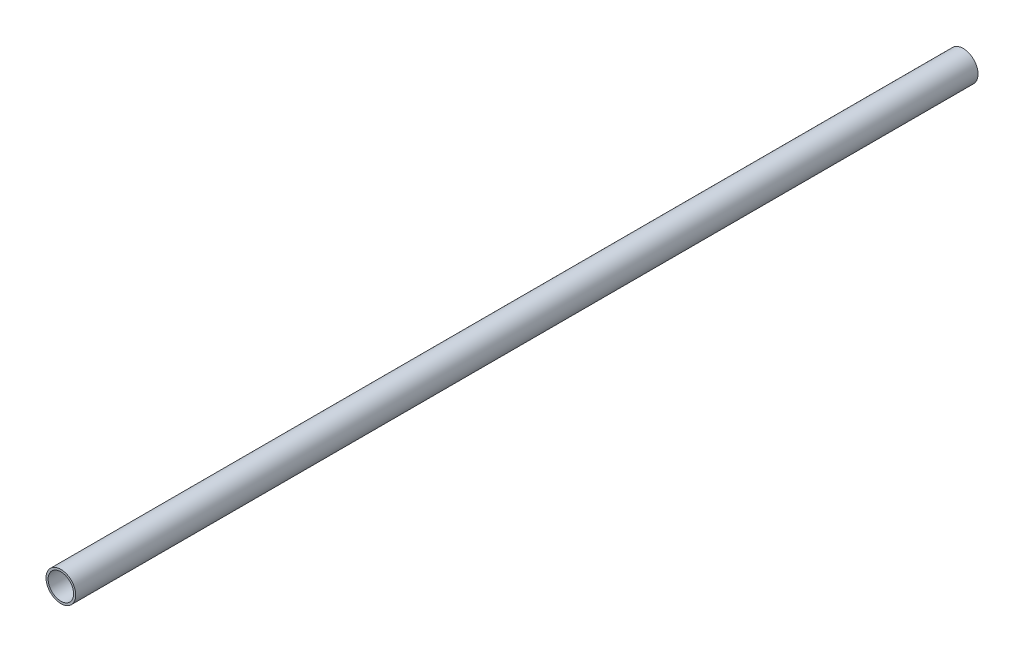
ISO-10303-21;
HEADER;
FILE_DESCRIPTION(('STEP AP214'),'2;1');
FILE_NAME('part.step','',(''),(''),'','','');
FILE_SCHEMA(('AUTOMOTIVE_DESIGN { 1 0 10303 214 1 1 1 1 }'));
ENDSEC;
DATA;
#1=APPLICATION_CONTEXT('core data for automotive mechanical design processes');
#2=APPLICATION_PROTOCOL_DEFINITION('international standard','automotive_design',2000,#1);
#3=PRODUCT_CONTEXT('',#1,'mechanical');
#4=PRODUCT('Part','Part','',(#3));
#5=PRODUCT_RELATED_PRODUCT_CATEGORY('part','',(#4));
#6=PRODUCT_DEFINITION_FORMATION('','',#4);
#7=PRODUCT_DEFINITION_CONTEXT('part definition',#1,'design');
#8=PRODUCT_DEFINITION('design','',#6,#7);
#9=PRODUCT_DEFINITION_SHAPE('','',#8);
#10=(LENGTH_UNIT() NAMED_UNIT(*) SI_UNIT(.MILLI.,.METRE.));
#11=(NAMED_UNIT(*) PLANE_ANGLE_UNIT() SI_UNIT($,.RADIAN.));
#12=(NAMED_UNIT(*) SI_UNIT($,.STERADIAN.) SOLID_ANGLE_UNIT());
#13=UNCERTAINTY_MEASURE_WITH_UNIT(LENGTH_MEASURE(1.E-05),#10,'distance_accuracy_value','');
#14=(GEOMETRIC_REPRESENTATION_CONTEXT(3) GLOBAL_UNCERTAINTY_ASSIGNED_CONTEXT((#13)) GLOBAL_UNIT_ASSIGNED_CONTEXT((#10,
#11,#12)) REPRESENTATION_CONTEXT('',''));
#15=CARTESIAN_POINT('',(0.,0.,0.));
#16=DIRECTION('',(0.,0.,1.));
#17=DIRECTION('',(1.,0.,0.));
#18=AXIS2_PLACEMENT_3D('',#15,#16,#17);
#19=CARTESIAN_POINT('',(0.,0.,424.86));
#20=DIRECTION('',(0.,0.,1.));
#21=DIRECTION('',(1.,0.,0.));
#22=AXIS2_PLACEMENT_3D('',#19,#20,#21);
#23=PLANE('',#22);
#24=CARTESIAN_POINT('',(0.,0.,424.86));
#25=DIRECTION('',(0.,0.,1.));
#26=DIRECTION('',(1.,0.,0.));
#27=AXIS2_PLACEMENT_3D('',#24,#25,#26);
#28=CIRCLE('',#27,7.);
#29=CARTESIAN_POINT('',(-7.,0.,424.86));
#30=VERTEX_POINT('',#29);
#31=EDGE_CURVE('E10',#30,#30,#28,.T.);
#32=ORIENTED_EDGE('',*,*,#31,.T.);
#33=EDGE_LOOP('',(#32));
#34=FACE_BOUND('',#33,.T.);
#35=CARTESIAN_POINT('',(0.,0.,424.86));
#36=DIRECTION('',(0.,0.,1.));
#37=DIRECTION('',(1.,0.,0.));
#38=AXIS2_PLACEMENT_3D('',#35,#36,#37);
#39=CIRCLE('',#38,6.);
#40=CARTESIAN_POINT('',(-6.,0.,424.86));
#41=VERTEX_POINT('',#40);
#42=EDGE_CURVE('E50',#41,#41,#39,.T.);
#43=ORIENTED_EDGE('',*,*,#42,.F.);
#44=EDGE_LOOP('',(#43));
#45=FACE_BOUND('',#44,.T.);
#46=ADVANCED_FACE('F37',(#34,#45),#23,.T.);
#47=CARTESIAN_POINT('',(0.,0.,0.));
#48=DIRECTION('',(0.,0.,1.));
#49=DIRECTION('',(1.,0.,0.));
#50=AXIS2_PLACEMENT_3D('',#47,#48,#49);
#51=PLANE('',#50);
#52=CARTESIAN_POINT('',(0.,0.,0.));
#53=DIRECTION('',(0.,0.,1.));
#54=DIRECTION('',(1.,0.,0.));
#55=AXIS2_PLACEMENT_3D('',#52,#53,#54);
#56=CIRCLE('',#55,7.);
#57=CARTESIAN_POINT('',(-7.,0.,0.));
#58=VERTEX_POINT('',#57);
#59=EDGE_CURVE('E41',#58,#58,#56,.T.);
#60=ORIENTED_EDGE('',*,*,#59,.F.);
#61=EDGE_LOOP('',(#60));
#62=FACE_BOUND('',#61,.T.);
#63=CARTESIAN_POINT('',(0.,0.,0.));
#64=DIRECTION('',(0.,0.,1.));
#65=DIRECTION('',(1.,0.,0.));
#66=AXIS2_PLACEMENT_3D('',#63,#64,#65);
#67=CIRCLE('',#66,6.);
#68=CARTESIAN_POINT('',(-6.,0.,0.));
#69=VERTEX_POINT('',#68);
#70=EDGE_CURVE('E52',#69,#69,#67,.T.);
#71=ORIENTED_EDGE('',*,*,#70,.T.);
#72=EDGE_LOOP('',(#71));
#73=FACE_BOUND('',#72,.T.);
#74=ADVANCED_FACE('F64',(#62,#73),#51,.F.);
#75=CARTESIAN_POINT('',(0.,0.,424.86));
#76=DIRECTION('',(0.,0.,-1.));
#77=DIRECTION('',(-1.,0.,0.));
#78=AXIS2_PLACEMENT_3D('',#75,#76,#77);
#79=CYLINDRICAL_SURFACE('',#78,7.);
#80=CARTESIAN_POINT('',(-7.,0.,424.86));
#81=CARTESIAN_POINT('',(-7.,0.,420.434375));
#82=CARTESIAN_POINT('',(-7.,0.,416.00875));
#83=CARTESIAN_POINT('',(-7.,0.,407.1575));
#84=CARTESIAN_POINT('',(-7.,0.,402.731875));
#85=CARTESIAN_POINT('',(-7.,0.,393.880625));
#86=CARTESIAN_POINT('',(-7.,0.,389.455));
#87=CARTESIAN_POINT('',(-7.,0.,380.60375));
#88=CARTESIAN_POINT('',(-7.,0.,376.178125));
#89=CARTESIAN_POINT('',(-7.,0.,367.326875));
#90=CARTESIAN_POINT('',(-7.,0.,362.90125));
#91=CARTESIAN_POINT('',(-7.,0.,354.05));
#92=CARTESIAN_POINT('',(-7.,0.,349.624375));
#93=CARTESIAN_POINT('',(-7.,0.,340.773125));
#94=CARTESIAN_POINT('',(-7.,0.,336.3475));
#95=CARTESIAN_POINT('',(-7.,0.,327.49625));
#96=CARTESIAN_POINT('',(-7.,0.,323.070625));
#97=CARTESIAN_POINT('',(-7.,0.,314.219375));
#98=CARTESIAN_POINT('',(-7.,0.,309.79375));
#99=CARTESIAN_POINT('',(-7.,0.,300.9425));
#100=CARTESIAN_POINT('',(-7.,0.,296.516875));
#101=CARTESIAN_POINT('',(-7.,0.,287.665625));
#102=CARTESIAN_POINT('',(-7.,0.,283.24));
#103=CARTESIAN_POINT('',(-7.,0.,274.38875));
#104=CARTESIAN_POINT('',(-7.,0.,269.963125));
#105=CARTESIAN_POINT('',(-7.,0.,261.111875));
#106=CARTESIAN_POINT('',(-7.,0.,256.68625));
#107=CARTESIAN_POINT('',(-7.,0.,247.835));
#108=CARTESIAN_POINT('',(-7.,0.,243.409375));
#109=CARTESIAN_POINT('',(-7.,0.,234.558125));
#110=CARTESIAN_POINT('',(-7.,0.,230.1325));
#111=CARTESIAN_POINT('',(-7.,0.,221.28125));
#112=CARTESIAN_POINT('',(-7.,0.,216.855625));
#113=CARTESIAN_POINT('',(-7.,0.,208.004375));
#114=CARTESIAN_POINT('',(-7.,0.,203.57875));
#115=CARTESIAN_POINT('',(-7.,0.,194.7275));
#116=CARTESIAN_POINT('',(-7.,0.,190.301875));
#117=CARTESIAN_POINT('',(-7.,0.,181.450625));
#118=CARTESIAN_POINT('',(-7.,0.,177.025));
#119=CARTESIAN_POINT('',(-7.,0.,168.17375));
#120=CARTESIAN_POINT('',(-7.,0.,163.748125));
#121=CARTESIAN_POINT('',(-7.,0.,154.896875));
#122=CARTESIAN_POINT('',(-7.,0.,150.47125));
#123=CARTESIAN_POINT('',(-7.,0.,141.62));
#124=CARTESIAN_POINT('',(-7.,0.,137.194375));
#125=CARTESIAN_POINT('',(-7.,0.,128.343125));
#126=CARTESIAN_POINT('',(-7.,0.,123.9175));
#127=CARTESIAN_POINT('',(-7.,0.,115.06625));
#128=CARTESIAN_POINT('',(-7.,0.,110.640625));
#129=CARTESIAN_POINT('',(-7.,0.,101.789375));
#130=CARTESIAN_POINT('',(-7.,0.,97.36375));
#131=CARTESIAN_POINT('',(-7.,0.,88.5125));
#132=CARTESIAN_POINT('',(-7.,0.,84.086875));
#133=CARTESIAN_POINT('',(-7.,0.,75.235625));
#134=CARTESIAN_POINT('',(-7.,0.,70.8099999999999));
#135=CARTESIAN_POINT('',(-7.,0.,61.95875));
#136=CARTESIAN_POINT('',(-7.,0.,57.533125));
#137=CARTESIAN_POINT('',(-7.,0.,48.681875));
#138=CARTESIAN_POINT('',(-7.,0.,44.25625));
#139=CARTESIAN_POINT('',(-7.,0.,35.4049999999999));
#140=CARTESIAN_POINT('',(-7.,0.,30.9793749999999));
#141=CARTESIAN_POINT('',(-7.,0.,22.1281249999999));
#142=CARTESIAN_POINT('',(-7.,0.,17.7025));
#143=CARTESIAN_POINT('',(-7.,0.,8.85124999999996));
#144=CARTESIAN_POINT('',(-7.,0.,4.42562499999995));
#145=CARTESIAN_POINT('',(-7.,0.,0.));
#146=B_SPLINE_CURVE_WITH_KNOTS('',3,(#80,#81,#82,#83,#84,#85,#86,#87,#88,#89,#90,#91,#92,#93,
#94,#95,#96,#97,#98,#99,#100,#101,#102,#103,#104,#105,#106,#107,#108,#109,#110,#111,#112,#113,
#114,#115,#116,#117,#118,#119,#120,#121,#122,#123,#124,#125,#126,#127,#128,#129,#130,#131,#132,
#133,#134,#135,#136,#137,#138,#139,#140,#141,#142,#143,#144,#145),.UNSPECIFIED.,.F.,.F.,(4,2,2,
2,2,2,2,2,2,2,2,2,2,2,2,2,2,2,2,2,2,2,2,2,2,2,2,2,2,2,2,2,4),(0.,13.276875,26.55375,39.830625,
53.1075,66.384375,79.66125,92.938125,106.215,119.491875,132.76875,146.045625,159.3225,
172.599375,185.87625,199.153125,212.43,225.706875,238.98375,252.260625,265.5375,278.814375,
292.09125,305.368125,318.645,331.921875,345.19875,358.475625,371.7525,385.029375,398.30625,
411.583125,424.86),.UNSPECIFIED.);
#147=EDGE_CURVE('BSEAM39',#30,#58,#146,.T.);
#148=ORIENTED_EDGE('',*,*,#31,.F.);
#149=ORIENTED_EDGE('',*,*,#59,.T.);
#150=ORIENTED_EDGE('',*,*,#147,.T.);
#151=ORIENTED_EDGE('',*,*,#147,.F.);
#152=EDGE_LOOP('',(#148,#150,#149,#151));
#153=FACE_BOUND('',#152,.T.);
#154=ADVANCED_FACE('F39',(#153),#79,.T.);
#155=CARTESIAN_POINT('',(0.,0.,424.86));
#156=DIRECTION('',(0.,0.,-1.));
#157=DIRECTION('',(-1.,0.,0.));
#158=AXIS2_PLACEMENT_3D('',#155,#156,#157);
#159=CYLINDRICAL_SURFACE('',#158,6.);
#160=CARTESIAN_POINT('',(-6.,0.,424.86));
#161=CARTESIAN_POINT('',(-6.,0.,420.434375));
#162=CARTESIAN_POINT('',(-6.,0.,416.00875));
#163=CARTESIAN_POINT('',(-6.,0.,407.1575));
#164=CARTESIAN_POINT('',(-6.,0.,402.731875));
#165=CARTESIAN_POINT('',(-6.,0.,393.880625));
#166=CARTESIAN_POINT('',(-6.,0.,389.455));
#167=CARTESIAN_POINT('',(-6.,0.,380.60375));
#168=CARTESIAN_POINT('',(-6.,0.,376.178125));
#169=CARTESIAN_POINT('',(-6.,0.,367.326875));
#170=CARTESIAN_POINT('',(-6.,0.,362.90125));
#171=CARTESIAN_POINT('',(-6.,0.,354.05));
#172=CARTESIAN_POINT('',(-6.,0.,349.624375));
#173=CARTESIAN_POINT('',(-6.,0.,340.773125));
#174=CARTESIAN_POINT('',(-6.,0.,336.3475));
#175=CARTESIAN_POINT('',(-6.,0.,327.49625));
#176=CARTESIAN_POINT('',(-6.,0.,323.070625));
#177=CARTESIAN_POINT('',(-6.,0.,314.219375));
#178=CARTESIAN_POINT('',(-6.,0.,309.79375));
#179=CARTESIAN_POINT('',(-6.,0.,300.9425));
#180=CARTESIAN_POINT('',(-6.,0.,296.516875));
#181=CARTESIAN_POINT('',(-6.,0.,287.665625));
#182=CARTESIAN_POINT('',(-6.,0.,283.24));
#183=CARTESIAN_POINT('',(-6.,0.,274.38875));
#184=CARTESIAN_POINT('',(-6.,0.,269.963125));
#185=CARTESIAN_POINT('',(-6.,0.,261.111875));
#186=CARTESIAN_POINT('',(-6.,0.,256.68625));
#187=CARTESIAN_POINT('',(-6.,0.,247.835));
#188=CARTESIAN_POINT('',(-6.,0.,243.409375));
#189=CARTESIAN_POINT('',(-6.,0.,234.558125));
#190=CARTESIAN_POINT('',(-6.,0.,230.1325));
#191=CARTESIAN_POINT('',(-6.,0.,221.28125));
#192=CARTESIAN_POINT('',(-6.,0.,216.855625));
#193=CARTESIAN_POINT('',(-6.,0.,208.004375));
#194=CARTESIAN_POINT('',(-6.,0.,203.57875));
#195=CARTESIAN_POINT('',(-6.,0.,194.7275));
#196=CARTESIAN_POINT('',(-6.,0.,190.301875));
#197=CARTESIAN_POINT('',(-6.,0.,181.450625));
#198=CARTESIAN_POINT('',(-6.,0.,177.025));
#199=CARTESIAN_POINT('',(-6.,0.,168.17375));
#200=CARTESIAN_POINT('',(-6.,0.,163.748125));
#201=CARTESIAN_POINT('',(-6.,0.,154.896875));
#202=CARTESIAN_POINT('',(-6.,0.,150.47125));
#203=CARTESIAN_POINT('',(-6.,0.,141.62));
#204=CARTESIAN_POINT('',(-6.,0.,137.194375));
#205=CARTESIAN_POINT('',(-6.,0.,128.343125));
#206=CARTESIAN_POINT('',(-6.,0.,123.9175));
#207=CARTESIAN_POINT('',(-6.,0.,115.06625));
#208=CARTESIAN_POINT('',(-6.,0.,110.640625));
#209=CARTESIAN_POINT('',(-6.,0.,101.789375));
#210=CARTESIAN_POINT('',(-6.,0.,97.36375));
#211=CARTESIAN_POINT('',(-6.,0.,88.5125));
#212=CARTESIAN_POINT('',(-6.,0.,84.086875));
#213=CARTESIAN_POINT('',(-6.,0.,75.235625));
#214=CARTESIAN_POINT('',(-6.,0.,70.8099999999999));
#215=CARTESIAN_POINT('',(-6.,0.,61.95875));
#216=CARTESIAN_POINT('',(-6.,0.,57.533125));
#217=CARTESIAN_POINT('',(-6.,0.,48.681875));
#218=CARTESIAN_POINT('',(-6.,0.,44.25625));
#219=CARTESIAN_POINT('',(-6.,0.,35.4049999999999));
#220=CARTESIAN_POINT('',(-6.,0.,30.9793749999999));
#221=CARTESIAN_POINT('',(-6.,0.,22.1281249999999));
#222=CARTESIAN_POINT('',(-6.,0.,17.7025));
#223=CARTESIAN_POINT('',(-6.,0.,8.85124999999996));
#224=CARTESIAN_POINT('',(-6.,0.,4.42562499999995));
#225=CARTESIAN_POINT('',(-6.,0.,0.));
#226=B_SPLINE_CURVE_WITH_KNOTS('',3,(#160,#161,#162,#163,#164,#165,#166,#167,#168,#169,#170,
#171,#172,#173,#174,#175,#176,#177,#178,#179,#180,#181,#182,#183,#184,#185,#186,#187,#188,#189,
#190,#191,#192,#193,#194,#195,#196,#197,#198,#199,#200,#201,#202,#203,#204,#205,#206,#207,#208,
#209,#210,#211,#212,#213,#214,#215,#216,#217,#218,#219,#220,#221,#222,#223,#224,#225),
.UNSPECIFIED.,.F.,.F.,(4,2,2,2,2,2,2,2,2,2,2,2,2,2,2,2,2,2,2,2,2,2,2,2,2,2,2,2,2,2,2,2,4),(0.,
13.276875,26.55375,39.830625,53.1075,66.384375,79.66125,92.938125,106.215,119.491875,132.76875,
146.045625,159.3225,172.599375,185.87625,199.153125,212.43,225.706875,238.98375,252.260625,
265.5375,278.814375,292.09125,305.368125,318.645,331.921875,345.19875,358.475625,371.7525,
385.029375,398.30625,411.583125,424.86),.UNSPECIFIED.);
#227=EDGE_CURVE('BSEAM60',#41,#69,#226,.T.);
#228=ORIENTED_EDGE('',*,*,#42,.T.);
#229=ORIENTED_EDGE('',*,*,#70,.F.);
#230=ORIENTED_EDGE('',*,*,#227,.T.);
#231=ORIENTED_EDGE('',*,*,#227,.F.);
#232=EDGE_LOOP('',(#228,#230,#229,#231));
#233=FACE_BOUND('',#232,.T.);
#234=ADVANCED_FACE('F60',(#233),#159,.F.);
#235=CLOSED_SHELL('',(#46,#74,#154,#234));
#236=MANIFOLD_SOLID_BREP('B2',#235);
#237=ADVANCED_BREP_SHAPE_REPRESENTATION('',(#18,#236),#14);
#238=SHAPE_DEFINITION_REPRESENTATION(#9,#237);
ENDSEC;
END-ISO-10303-21;
